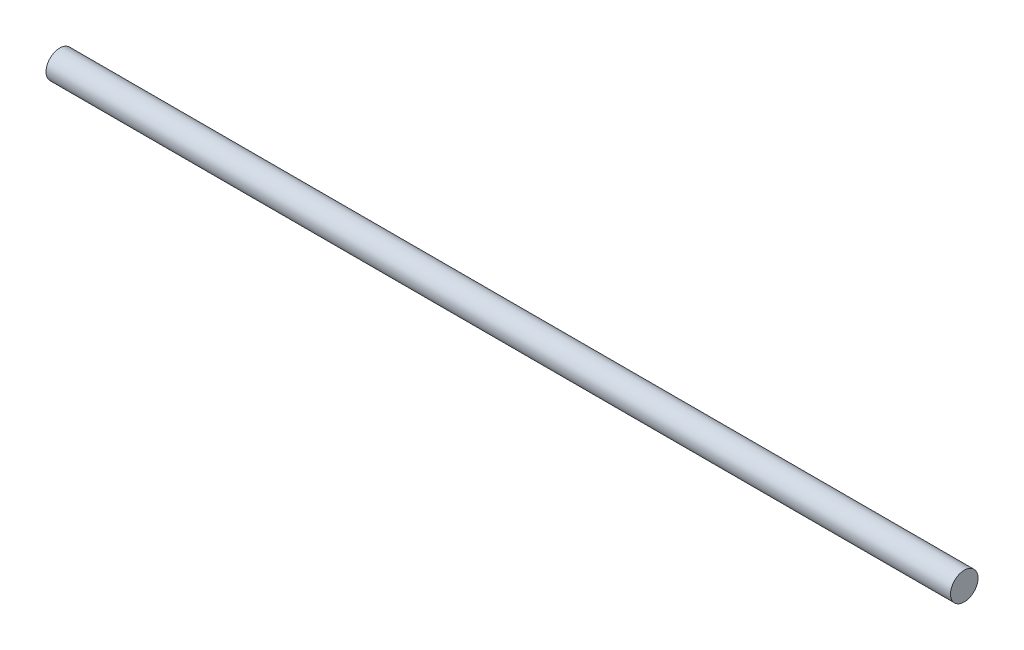
ISO-10303-21;
HEADER;
FILE_DESCRIPTION(('STEP AP214'),'2;1');
FILE_NAME('part.step','',(''),(''),'','','');
FILE_SCHEMA(('AUTOMOTIVE_DESIGN { 1 0 10303 214 1 1 1 1 }'));
ENDSEC;
DATA;
#1=APPLICATION_CONTEXT('core data for automotive mechanical design processes');
#2=APPLICATION_PROTOCOL_DEFINITION('international standard','automotive_design',2000,#1);
#3=PRODUCT_CONTEXT('',#1,'mechanical');
#4=PRODUCT('Part','Part','',(#3));
#5=PRODUCT_RELATED_PRODUCT_CATEGORY('part','',(#4));
#6=PRODUCT_DEFINITION_FORMATION('','',#4);
#7=PRODUCT_DEFINITION_CONTEXT('part definition',#1,'design');
#8=PRODUCT_DEFINITION('design','',#6,#7);
#9=PRODUCT_DEFINITION_SHAPE('','',#8);
#10=(LENGTH_UNIT() NAMED_UNIT(*) SI_UNIT(.MILLI.,.METRE.));
#11=(NAMED_UNIT(*) PLANE_ANGLE_UNIT() SI_UNIT($,.RADIAN.));
#12=(NAMED_UNIT(*) SI_UNIT($,.STERADIAN.) SOLID_ANGLE_UNIT());
#13=UNCERTAINTY_MEASURE_WITH_UNIT(LENGTH_MEASURE(1.E-05),#10,'distance_accuracy_value','');
#14=(GEOMETRIC_REPRESENTATION_CONTEXT(3) GLOBAL_UNCERTAINTY_ASSIGNED_CONTEXT((#13)) GLOBAL_UNIT_ASSIGNED_CONTEXT((#10,
#11,#12)) REPRESENTATION_CONTEXT('',''));
#15=CARTESIAN_POINT('',(0.,0.,0.));
#16=DIRECTION('',(0.,0.,1.));
#17=DIRECTION('',(1.,0.,0.));
#18=AXIS2_PLACEMENT_3D('',#15,#16,#17);
#19=CARTESIAN_POINT('',(0.,0.,0.));
#20=DIRECTION('',(1.,0.,0.));
#21=DIRECTION('',(0.,0.,-1.));
#22=AXIS2_PLACEMENT_3D('',#19,#20,#21);
#23=PLANE('',#22);
#24=CARTESIAN_POINT('',(0.,0.,0.));
#25=DIRECTION('',(-1.,0.,0.));
#26=DIRECTION('',(0.,0.,1.));
#27=AXIS2_PLACEMENT_3D('',#24,#25,#26);
#28=CIRCLE('',#27,7.);
#29=CARTESIAN_POINT('',(0.,0.,7.));
#30=VERTEX_POINT('',#29);
#31=EDGE_CURVE('E10',#30,#30,#28,.T.);
#32=ORIENTED_EDGE('',*,*,#31,.T.);
#33=EDGE_LOOP('',(#32));
#34=FACE_BOUND('',#33,.T.);
#35=ADVANCED_FACE('F32',(#34),#23,.F.);
#36=CARTESIAN_POINT('',(0.,0.,0.));
#37=DIRECTION('',(-1.,0.,0.));
#38=DIRECTION('',(0.,0.,1.));
#39=AXIS2_PLACEMENT_3D('',#36,#37,#38);
#40=CYLINDRICAL_SURFACE('',#39,7.);
#41=ORIENTED_EDGE('',*,*,#31,.F.);
#42=EDGE_LOOP('',(#41));
#43=FACE_BOUND('',#42,.T.);
#44=CARTESIAN_POINT('',(460.,0.,0.));
#45=DIRECTION('',(-1.,0.,0.));
#46=DIRECTION('',(0.,0.,1.));
#47=AXIS2_PLACEMENT_3D('',#44,#45,#46);
#48=CIRCLE('',#47,7.);
#49=CARTESIAN_POINT('',(460.,0.,7.));
#50=VERTEX_POINT('',#49);
#51=EDGE_CURVE('E38',#50,#50,#48,.T.);
#52=ORIENTED_EDGE('',*,*,#51,.T.);
#53=EDGE_LOOP('',(#52));
#54=FACE_BOUND('',#53,.T.);
#55=ADVANCED_FACE('F44',(#43,#54),#40,.T.);
#56=CARTESIAN_POINT('',(460.,0.,0.));
#57=DIRECTION('',(-1.,0.,0.));
#58=DIRECTION('',(0.,0.,1.));
#59=AXIS2_PLACEMENT_3D('',#56,#57,#58);
#60=PLANE('',#59);
#61=ORIENTED_EDGE('',*,*,#51,.F.);
#62=EDGE_LOOP('',(#61));
#63=FACE_BOUND('',#62,.T.);
#64=ADVANCED_FACE('F46',(#63),#60,.F.);
#65=CLOSED_SHELL('',(#35,#55,#64));
#66=MANIFOLD_SOLID_BREP('B2',#65);
#67=ADVANCED_BREP_SHAPE_REPRESENTATION('',(#18,#66),#14);
#68=SHAPE_DEFINITION_REPRESENTATION(#9,#67);
ENDSEC;
END-ISO-10303-21;
